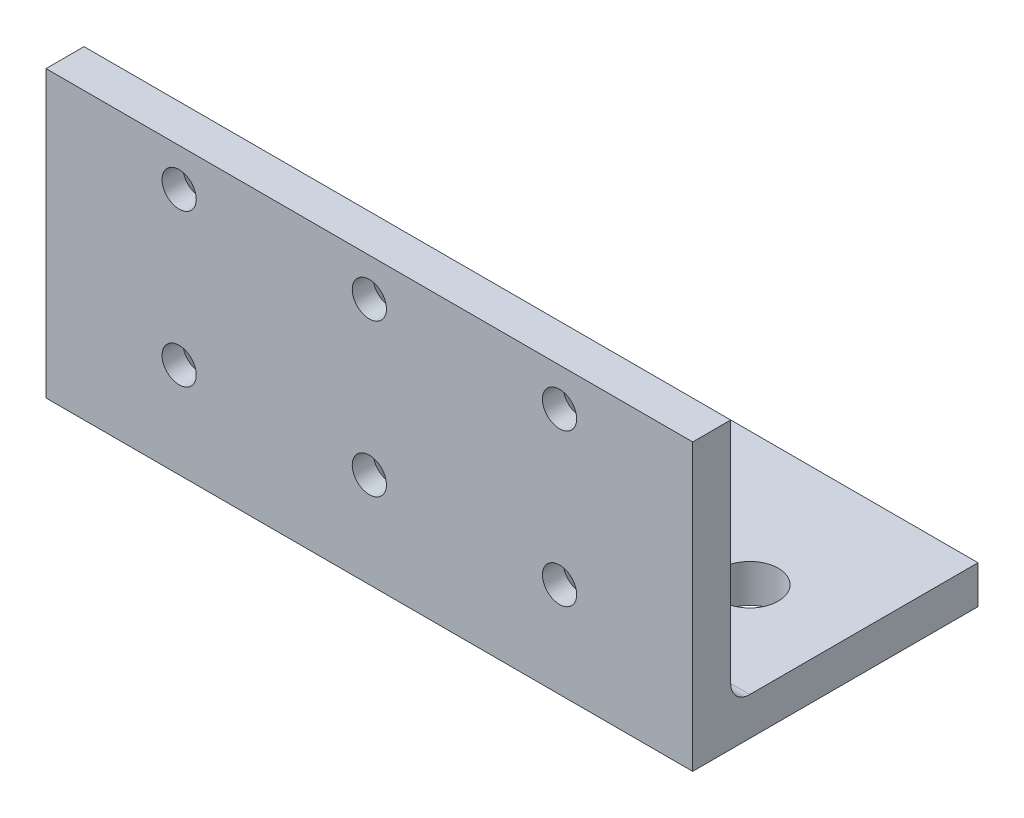
ISO-10303-21;
HEADER;
FILE_DESCRIPTION(('STEP AP214'),'2;1');
FILE_NAME('part.step','',(''),(''),'','','');
FILE_SCHEMA(('AUTOMOTIVE_DESIGN { 1 0 10303 214 1 1 1 1 }'));
ENDSEC;
DATA;
#1=APPLICATION_CONTEXT('core data for automotive mechanical design processes');
#2=APPLICATION_PROTOCOL_DEFINITION('international standard','automotive_design',2000,#1);
#3=PRODUCT_CONTEXT('',#1,'mechanical');
#4=PRODUCT('Part','Part','',(#3));
#5=PRODUCT_RELATED_PRODUCT_CATEGORY('part','',(#4));
#6=PRODUCT_DEFINITION_FORMATION('','',#4);
#7=PRODUCT_DEFINITION_CONTEXT('part definition',#1,'design');
#8=PRODUCT_DEFINITION('design','',#6,#7);
#9=PRODUCT_DEFINITION_SHAPE('','',#8);
#10=(LENGTH_UNIT() NAMED_UNIT(*) SI_UNIT(.MILLI.,.METRE.));
#11=(NAMED_UNIT(*) PLANE_ANGLE_UNIT() SI_UNIT($,.RADIAN.));
#12=(NAMED_UNIT(*) SI_UNIT($,.STERADIAN.) SOLID_ANGLE_UNIT());
#13=UNCERTAINTY_MEASURE_WITH_UNIT(LENGTH_MEASURE(1.E-05),#10,'distance_accuracy_value','');
#14=(GEOMETRIC_REPRESENTATION_CONTEXT(3) GLOBAL_UNCERTAINTY_ASSIGNED_CONTEXT((#13)) GLOBAL_UNIT_ASSIGNED_CONTEXT((#10,
#11,#12)) REPRESENTATION_CONTEXT('',''));
#15=CARTESIAN_POINT('',(0.,0.,0.));
#16=DIRECTION('',(0.,0.,1.));
#17=DIRECTION('',(1.,0.,0.));
#18=AXIS2_PLACEMENT_3D('',#15,#16,#17);
#19=CARTESIAN_POINT('',(34.,14.9999999999999,-2.00000000000061));
#20=DIRECTION('',(0.,-1.,0.));
#21=DIRECTION('',(0.,0.,-1.));
#22=AXIS2_PLACEMENT_3D('',#19,#20,#21);
#23=PLANE('',#22);
#24=DIRECTION('',(0.,0.,1.));
#25=VECTOR('',#24,1.);
#26=CARTESIAN_POINT('',(0.,15.,-1.99999999999986));
#27=LINE('',#26,#25);
#28=CARTESIAN_POINT('',(0.,15.,-1.99999999999986));
#29=VERTEX_POINT('',#28);
#30=CARTESIAN_POINT('',(0.,14.9999999999999,1.38777878078145E-13));
#31=VERTEX_POINT('',#30);
#32=EDGE_CURVE('E131',#29,#31,#27,.T.);
#33=ORIENTED_EDGE('',*,*,#32,.T.);
#34=DIRECTION('',(-1.,0.,0.));
#35=VECTOR('',#34,1.);
#36=CARTESIAN_POINT('',(34.,15.,-6.10622663543836E-13));
#37=LINE('',#36,#35);
#38=CARTESIAN_POINT('',(34.,15.,-6.10622663543836E-13));
#39=VERTEX_POINT('',#38);
#40=EDGE_CURVE('E112',#39,#31,#37,.T.);
#41=ORIENTED_EDGE('',*,*,#40,.F.);
#42=DIRECTION('',(0.,0.,1.));
#43=VECTOR('',#42,1.);
#44=CARTESIAN_POINT('',(34.,14.9999999999999,-2.00000000000061));
#45=LINE('',#44,#43);
#46=CARTESIAN_POINT('',(34.,14.9999999999999,-2.00000000000061));
#47=VERTEX_POINT('',#46);
#48=EDGE_CURVE('E119',#47,#39,#45,.T.);
#49=ORIENTED_EDGE('',*,*,#48,.F.);
#50=DIRECTION('',(-1.,0.,0.));
#51=VECTOR('',#50,1.);
#52=CARTESIAN_POINT('',(34.,14.9999999999999,-2.00000000000061));
#53=LINE('',#52,#51);
#54=EDGE_CURVE('E173',#47,#29,#53,.T.);
#55=ORIENTED_EDGE('',*,*,#54,.T.);
#56=EDGE_LOOP('',(#33,#41,#49,#55));
#57=FACE_BOUND('',#56,.T.);
#58=ADVANCED_FACE('F47',(#57),#23,.F.);
#59=CARTESIAN_POINT('',(34.,15.,-6.10622663543836E-13));
#60=DIRECTION('',(0.,0.,-1.));
#61=DIRECTION('',(0.,1.,0.));
#62=AXIS2_PLACEMENT_3D('',#59,#60,#61);
#63=PLANE('',#62);
#64=CARTESIAN_POINT('',(27.,4.9999999999999,-7.07767178198537E-13));
#65=DIRECTION('',(0.,0.,-1.));
#66=DIRECTION('',(0.,1.,0.));
#67=AXIS2_PLACEMENT_3D('',#64,#65,#66);
#68=CIRCLE('',#67,0.899999999999995);
#69=CARTESIAN_POINT('',(27.,5.89999999999989,-6.99611932931878E-13));
#70=VERTEX_POINT('',#69);
#71=EDGE_CURVE('E380',#70,#70,#68,.T.);
#72=ORIENTED_EDGE('',*,*,#71,.T.);
#73=EDGE_LOOP('',(#72));
#74=FACE_BOUND('',#73,.T.);
#75=CARTESIAN_POINT('',(26.9999999999997,12.9999999999999,-7.63278329429795E-13));
#76=DIRECTION('',(0.,0.,-1.));
#77=DIRECTION('',(0.,1.,0.));
#78=AXIS2_PLACEMENT_3D('',#75,#76,#77);
#79=CIRCLE('',#78,0.899999999999995);
#80=CARTESIAN_POINT('',(26.9999999999997,13.8999999999999,-7.55123084163136E-13));
#81=VERTEX_POINT('',#80);
#82=EDGE_CURVE('E389',#81,#81,#79,.T.);
#83=ORIENTED_EDGE('',*,*,#82,.T.);
#84=EDGE_LOOP('',(#83));
#85=FACE_BOUND('',#84,.T.);
#86=CARTESIAN_POINT('',(7.00000000000001,4.9999999999999,0.));
#87=DIRECTION('',(0.,0.,-1.));
#88=DIRECTION('',(0.,1.,0.));
#89=AXIS2_PLACEMENT_3D('',#86,#87,#88);
#90=CIRCLE('',#89,0.899999999999995);
#91=CARTESIAN_POINT('',(7.00000000000001,5.89999999999989,0.));
#92=VERTEX_POINT('',#91);
#93=EDGE_CURVE('E398',#92,#92,#90,.T.);
#94=ORIENTED_EDGE('',*,*,#93,.T.);
#95=EDGE_LOOP('',(#94));
#96=FACE_BOUND('',#95,.T.);
#97=CARTESIAN_POINT('',(6.99999999999973,12.9999999999999,0.));
#98=DIRECTION('',(0.,0.,-1.));
#99=DIRECTION('',(0.,1.,0.));
#100=AXIS2_PLACEMENT_3D('',#97,#98,#99);
#101=CIRCLE('',#100,0.899999999999995);
#102=CARTESIAN_POINT('',(6.99999999999973,13.8999999999999,0.));
#103=VERTEX_POINT('',#102);
#104=EDGE_CURVE('E407',#103,#103,#101,.T.);
#105=ORIENTED_EDGE('',*,*,#104,.T.);
#106=EDGE_LOOP('',(#105));
#107=FACE_BOUND('',#106,.T.);
#108=CARTESIAN_POINT('',(16.9999999999997,13.,-2.63677968348475E-13));
#109=DIRECTION('',(0.,0.,-1.));
#110=DIRECTION('',(0.,1.,0.));
#111=AXIS2_PLACEMENT_3D('',#108,#109,#110);
#112=CIRCLE('',#111,0.899999999999995);
#113=CARTESIAN_POINT('',(16.9999999999997,13.9,-2.55522723081815E-13));
#114=VERTEX_POINT('',#113);
#115=EDGE_CURVE('E51',#114,#114,#112,.T.);
#116=ORIENTED_EDGE('',*,*,#115,.T.);
#117=EDGE_LOOP('',(#116));
#118=FACE_BOUND('',#117,.T.);
#119=CARTESIAN_POINT('',(17.,4.99999999999998,0.));
#120=DIRECTION('',(0.,0.,-1.));
#121=DIRECTION('',(0.,1.,0.));
#122=AXIS2_PLACEMENT_3D('',#119,#120,#121);
#123=CIRCLE('',#122,0.899999999999995);
#124=CARTESIAN_POINT('',(17.,5.89999999999997,0.));
#125=VERTEX_POINT('',#124);
#126=EDGE_CURVE('E148',#125,#125,#123,.T.);
#127=ORIENTED_EDGE('',*,*,#126,.T.);
#128=EDGE_LOOP('',(#127));
#129=FACE_BOUND('',#128,.T.);
#130=DIRECTION('',(0.,-1.,0.));
#131=VECTOR('',#130,1.);
#132=CARTESIAN_POINT('',(0.,14.9999999999999,1.38777878078145E-13));
#133=LINE('',#132,#131);
#134=CARTESIAN_POINT('',(0.,0.,0.));
#135=VERTEX_POINT('',#134);
#136=EDGE_CURVE('E175',#31,#135,#133,.T.);
#137=ORIENTED_EDGE('',*,*,#136,.T.);
#138=DIRECTION('',(-1.,0.,0.));
#139=VECTOR('',#138,1.);
#140=CARTESIAN_POINT('',(34.,0.,-3.05311331771918E-13));
#141=LINE('',#140,#139);
#142=CARTESIAN_POINT('',(34.,0.,-3.05311331771918E-13));
#143=VERTEX_POINT('',#142);
#144=EDGE_CURVE('E115',#143,#135,#141,.T.);
#145=ORIENTED_EDGE('',*,*,#144,.F.);
#146=DIRECTION('',(0.,-1.,0.));
#147=VECTOR('',#146,1.);
#148=CARTESIAN_POINT('',(34.,15.,-6.10622663543836E-13));
#149=LINE('',#148,#147);
#150=EDGE_CURVE('E108',#39,#143,#149,.T.);
#151=ORIENTED_EDGE('',*,*,#150,.F.);
#152=ORIENTED_EDGE('',*,*,#40,.T.);
#153=EDGE_LOOP('',(#137,#145,#151,#152));
#154=FACE_BOUND('',#153,.T.);
#155=ADVANCED_FACE('F110',(#74,#85,#96,#107,#118,#129,#154),#63,.F.);
#156=CARTESIAN_POINT('',(34.,0.,-3.05311331771918E-13));
#157=DIRECTION('',(0.,1.,0.));
#158=DIRECTION('',(0.,0.,1.));
#159=AXIS2_PLACEMENT_3D('',#156,#157,#158);
#160=PLANE('',#159);
#161=CARTESIAN_POINT('',(28.999999992422,0.,-7.9999999929985));
#162=DIRECTION('',(0.,-1.,0.));
#163=DIRECTION('',(0.,0.,-1.));
#164=AXIS2_PLACEMENT_3D('',#161,#162,#163);
#165=CIRCLE('',#164,1.5);
#166=CARTESIAN_POINT('',(28.999999992422,0.,-9.4999999929985));
#167=VERTEX_POINT('',#166);
#168=EDGE_CURVE('E146',#167,#167,#165,.T.);
#169=ORIENTED_EDGE('',*,*,#168,.F.);
#170=EDGE_LOOP('',(#169));
#171=FACE_BOUND('',#170,.T.);
#172=CARTESIAN_POINT('',(5.,0.,-8.00000000000001));
#173=DIRECTION('',(0.,-1.,0.));
#174=DIRECTION('',(0.,0.,-1.));
#175=AXIS2_PLACEMENT_3D('',#172,#173,#174);
#176=CIRCLE('',#175,1.5);
#177=CARTESIAN_POINT('',(5.,0.,-9.50000000000001));
#178=VERTEX_POINT('',#177);
#179=EDGE_CURVE('E150',#178,#178,#176,.T.);
#180=ORIENTED_EDGE('',*,*,#179,.F.);
#181=EDGE_LOOP('',(#180));
#182=FACE_BOUND('',#181,.T.);
#183=DIRECTION('',(0.,0.,-1.));
#184=VECTOR('',#183,1.);
#185=CARTESIAN_POINT('',(0.,0.,0.));
#186=LINE('',#185,#184);
#187=CARTESIAN_POINT('',(0.,0.,-14.9999999999999));
#188=VERTEX_POINT('',#187);
#189=EDGE_CURVE('E177',#135,#188,#186,.T.);
#190=ORIENTED_EDGE('',*,*,#189,.T.);
#191=DIRECTION('',(-1.,0.,0.));
#192=VECTOR('',#191,1.);
#193=CARTESIAN_POINT('',(34.,0.,-15.0000000000004));
#194=LINE('',#193,#192);
#195=CARTESIAN_POINT('',(34.,0.,-15.0000000000004));
#196=VERTEX_POINT('',#195);
#197=EDGE_CURVE('E136',#196,#188,#194,.T.);
#198=ORIENTED_EDGE('',*,*,#197,.F.);
#199=DIRECTION('',(0.,0.,-1.));
#200=VECTOR('',#199,1.);
#201=CARTESIAN_POINT('',(34.,0.,-3.05311331771918E-13));
#202=LINE('',#201,#200);
#203=EDGE_CURVE('E118',#143,#196,#202,.T.);
#204=ORIENTED_EDGE('',*,*,#203,.F.);
#205=ORIENTED_EDGE('',*,*,#144,.T.);
#206=EDGE_LOOP('',(#190,#198,#204,#205));
#207=FACE_BOUND('',#206,.T.);
#208=ADVANCED_FACE('F203',(#171,#182,#207),#160,.F.);
#209=CARTESIAN_POINT('',(34.,0.,-15.0000000000004));
#210=DIRECTION('',(0.,0.,1.));
#211=DIRECTION('',(1.,0.,0.));
#212=AXIS2_PLACEMENT_3D('',#209,#210,#211);
#213=PLANE('',#212);
#214=DIRECTION('',(0.,1.,0.));
#215=VECTOR('',#214,1.);
#216=CARTESIAN_POINT('',(0.,0.,-14.9999999999999));
#217=LINE('',#216,#215);
#218=CARTESIAN_POINT('',(0.,1.99999999999991,-14.9999999999999));
#219=VERTEX_POINT('',#218);
#220=EDGE_CURVE('E179',#188,#219,#217,.T.);
#221=ORIENTED_EDGE('',*,*,#220,.T.);
#222=DIRECTION('',(-1.,0.,0.));
#223=VECTOR('',#222,1.);
#224=CARTESIAN_POINT('',(34.,2.00000000000005,-15.0000000000004));
#225=LINE('',#224,#223);
#226=CARTESIAN_POINT('',(34.,2.00000000000005,-15.0000000000004));
#227=VERTEX_POINT('',#226);
#228=EDGE_CURVE('E185',#227,#219,#225,.T.);
#229=ORIENTED_EDGE('',*,*,#228,.F.);
#230=DIRECTION('',(0.,1.,0.));
#231=VECTOR('',#230,1.);
#232=CARTESIAN_POINT('',(34.,0.,-15.0000000000004));
#233=LINE('',#232,#231);
#234=EDGE_CURVE('E168',#196,#227,#233,.T.);
#235=ORIENTED_EDGE('',*,*,#234,.F.);
#236=ORIENTED_EDGE('',*,*,#197,.T.);
#237=EDGE_LOOP('',(#221,#229,#235,#236));
#238=FACE_BOUND('',#237,.T.);
#239=ADVANCED_FACE('F192',(#238),#213,.F.);
#240=CARTESIAN_POINT('',(34.,2.00000000000005,-15.0000000000004));
#241=DIRECTION('',(0.,-1.,0.));
#242=DIRECTION('',(0.,0.,-1.));
#243=AXIS2_PLACEMENT_3D('',#240,#241,#242);
#244=PLANE('',#243);
#245=CARTESIAN_POINT('',(28.999999992422,2.,-7.99999999299864));
#246=DIRECTION('',(0.,-1.,0.));
#247=DIRECTION('',(0.,0.,-1.));
#248=AXIS2_PLACEMENT_3D('',#245,#246,#247);
#249=CIRCLE('',#248,1.5);
#250=CARTESIAN_POINT('',(28.999999992422,1.99999999999998,-9.49999999299864));
#251=VERTEX_POINT('',#250);
#252=EDGE_CURVE('E145',#251,#251,#249,.T.);
#253=ORIENTED_EDGE('',*,*,#252,.T.);
#254=EDGE_LOOP('',(#253));
#255=FACE_BOUND('',#254,.T.);
#256=CARTESIAN_POINT('',(5.,1.99999999999999,-8.00000000000015));
#257=DIRECTION('',(0.,-1.,0.));
#258=DIRECTION('',(0.,0.,-1.));
#259=AXIS2_PLACEMENT_3D('',#256,#257,#258);
#260=CIRCLE('',#259,1.5);
#261=CARTESIAN_POINT('',(5.,1.99999999999998,-9.50000000000015));
#262=VERTEX_POINT('',#261);
#263=EDGE_CURVE('E142',#262,#262,#260,.T.);
#264=ORIENTED_EDGE('',*,*,#263,.T.);
#265=EDGE_LOOP('',(#264));
#266=FACE_BOUND('',#265,.T.);
#267=DIRECTION('',(0.,0.,1.));
#268=VECTOR('',#267,1.);
#269=CARTESIAN_POINT('',(0.,1.99999999999991,-14.9999999999999));
#270=LINE('',#269,#268);
#271=CARTESIAN_POINT('',(0.,2.00000000000008,-3.00000000000011));
#272=VERTEX_POINT('',#271);
#273=EDGE_CURVE('E181',#219,#272,#270,.T.);
#274=ORIENTED_EDGE('',*,*,#273,.T.);
#275=DIRECTION('',(-1.,0.,0.));
#276=VECTOR('',#275,1.);
#277=CARTESIAN_POINT('',(34.,2.,-3.00000000000042));
#278=LINE('',#277,#276);
#279=CARTESIAN_POINT('',(34.,2.,-3.00000000000042));
#280=VERTEX_POINT('',#279);
#281=EDGE_CURVE('E64',#272,#280,#278,.F.);
#282=ORIENTED_EDGE('',*,*,#281,.T.);
#283=DIRECTION('',(0.,0.,1.));
#284=VECTOR('',#283,1.);
#285=CARTESIAN_POINT('',(34.,2.00000000000005,-15.0000000000004));
#286=LINE('',#285,#284);
#287=EDGE_CURVE('E170',#227,#280,#286,.T.);
#288=ORIENTED_EDGE('',*,*,#287,.F.);
#289=ORIENTED_EDGE('',*,*,#228,.T.);
#290=EDGE_LOOP('',(#274,#282,#288,#289));
#291=FACE_BOUND('',#290,.T.);
#292=ADVANCED_FACE('F197',(#255,#266,#291),#244,.F.);
#293=CARTESIAN_POINT('',(34.0000000000001,2.,-2.00000000000031));
#294=DIRECTION('',(0.,0.,1.));
#295=DIRECTION('',(0.,-1.,0.));
#296=AXIS2_PLACEMENT_3D('',#293,#294,#295);
#297=PLANE('',#296);
#298=CARTESIAN_POINT('',(27.0000000000003,4.99999999999992,-2.00000000000071));
#299=DIRECTION('',(0.,0.,-1.));
#300=DIRECTION('',(0.,1.,0.));
#301=AXIS2_PLACEMENT_3D('',#298,#299,#300);
#302=CIRCLE('',#301,1.8);
#303=CARTESIAN_POINT('',(27.0000000000003,6.79999999999992,-2.00000000000069));
#304=VERTEX_POINT('',#303);
#305=EDGE_CURVE('E379',#304,#304,#302,.T.);
#306=ORIENTED_EDGE('',*,*,#305,.F.);
#307=EDGE_LOOP('',(#306));
#308=FACE_BOUND('',#307,.T.);
#309=CARTESIAN_POINT('',(26.9999999999997,12.9999999999999,-2.00000000000067));
#310=DIRECTION('',(0.,0.,-1.));
#311=DIRECTION('',(0.,1.,0.));
#312=AXIS2_PLACEMENT_3D('',#309,#310,#311);
#313=CIRCLE('',#312,1.8);
#314=CARTESIAN_POINT('',(26.9999999999997,14.7999999999999,-2.00000000000065));
#315=VERTEX_POINT('',#314);
#316=EDGE_CURVE('E386',#315,#315,#313,.T.);
#317=ORIENTED_EDGE('',*,*,#316,.F.);
#318=EDGE_LOOP('',(#317));
#319=FACE_BOUND('',#318,.T.);
#320=CARTESIAN_POINT('',(7.00000000000028,4.99999999999998,-2.00000000000004));
#321=DIRECTION('',(0.,0.,-1.));
#322=DIRECTION('',(0.,1.,0.));
#323=AXIS2_PLACEMENT_3D('',#320,#321,#322);
#324=CIRCLE('',#323,1.8);
#325=CARTESIAN_POINT('',(7.00000000000028,6.79999999999998,-2.00000000000003));
#326=VERTEX_POINT('',#325);
#327=EDGE_CURVE('E395',#326,#326,#324,.T.);
#328=ORIENTED_EDGE('',*,*,#327,.F.);
#329=EDGE_LOOP('',(#328));
#330=FACE_BOUND('',#329,.T.);
#331=CARTESIAN_POINT('',(6.99999999999973,13.,-2.00000000000003));
#332=DIRECTION('',(0.,0.,-1.));
#333=DIRECTION('',(0.,1.,0.));
#334=AXIS2_PLACEMENT_3D('',#331,#332,#333);
#335=CIRCLE('',#334,1.8);
#336=CARTESIAN_POINT('',(6.99999999999973,14.8,-2.00000000000001));
#337=VERTEX_POINT('',#336);
#338=EDGE_CURVE('E404',#337,#337,#335,.T.);
#339=ORIENTED_EDGE('',*,*,#338,.F.);
#340=EDGE_LOOP('',(#339));
#341=FACE_BOUND('',#340,.T.);
#342=CARTESIAN_POINT('',(16.9999999999997,13.,-1.99999999999995));
#343=DIRECTION('',(0.,0.,-1.));
#344=DIRECTION('',(0.,1.,0.));
#345=AXIS2_PLACEMENT_3D('',#342,#343,#344);
#346=CIRCLE('',#345,1.8);
#347=CARTESIAN_POINT('',(16.9999999999997,14.8,-1.99999999999993));
#348=VERTEX_POINT('',#347);
#349=EDGE_CURVE('E413',#348,#348,#346,.T.);
#350=ORIENTED_EDGE('',*,*,#349,.F.);
#351=EDGE_LOOP('',(#350));
#352=FACE_BOUND('',#351,.T.);
#353=CARTESIAN_POINT('',(17.0000000000003,4.99999999999998,-1.99999999999999));
#354=DIRECTION('',(0.,0.,-1.));
#355=DIRECTION('',(0.,1.,0.));
#356=AXIS2_PLACEMENT_3D('',#353,#354,#355);
#357=CIRCLE('',#356,1.8);
#358=CARTESIAN_POINT('',(17.0000000000003,6.79999999999998,-1.99999999999997));
#359=VERTEX_POINT('',#358);
#360=EDGE_CURVE('E157',#359,#359,#357,.T.);
#361=ORIENTED_EDGE('',*,*,#360,.F.);
#362=EDGE_LOOP('',(#361));
#363=FACE_BOUND('',#362,.T.);
#364=DIRECTION('',(0.,1.,0.));
#365=VECTOR('',#364,1.);
#366=CARTESIAN_POINT('',(34.0000000000001,2.,-2.00000000000031));
#367=LINE('',#366,#365);
#368=CARTESIAN_POINT('',(34.0000000000003,2.99999999999989,-2.00000000000031));
#369=VERTEX_POINT('',#368);
#370=EDGE_CURVE('E124',#369,#47,#367,.T.);
#371=ORIENTED_EDGE('',*,*,#370,.F.);
#372=DIRECTION('',(-1.,0.,0.));
#373=VECTOR('',#372,1.);
#374=CARTESIAN_POINT('',(2.77555756156289E-13,2.99999999999998,-2.));
#375=LINE('',#374,#373);
#376=CARTESIAN_POINT('',(2.77555756156289E-13,2.99999999999998,-2.));
#377=VERTEX_POINT('',#376);
#378=EDGE_CURVE('E132',#369,#377,#375,.T.);
#379=ORIENTED_EDGE('',*,*,#378,.T.);
#380=DIRECTION('',(0.,1.,0.));
#381=VECTOR('',#380,1.);
#382=CARTESIAN_POINT('',(0.,2.00000000000009,-2.));
#383=LINE('',#382,#381);
#384=EDGE_CURVE('E128',#377,#29,#383,.T.);
#385=ORIENTED_EDGE('',*,*,#384,.T.);
#386=ORIENTED_EDGE('',*,*,#54,.F.);
#387=EDGE_LOOP('',(#371,#379,#385,#386));
#388=FACE_BOUND('',#387,.T.);
#389=ADVANCED_FACE('F202',(#308,#319,#330,#341,#352,#363,#388),#297,.F.);
#390=CARTESIAN_POINT('',(34.,0.,-3.05311331771918E-13));
#391=DIRECTION('',(1.,0.,0.));
#392=DIRECTION('',(0.,0.,-1.));
#393=AXIS2_PLACEMENT_3D('',#390,#391,#392);
#394=PLANE('',#393);
#395=ORIENTED_EDGE('',*,*,#48,.T.);
#396=ORIENTED_EDGE('',*,*,#150,.T.);
#397=ORIENTED_EDGE('',*,*,#203,.T.);
#398=ORIENTED_EDGE('',*,*,#234,.T.);
#399=ORIENTED_EDGE('',*,*,#287,.T.);
#400=CARTESIAN_POINT('',(34.,2.99999999999989,-3.00000000000042));
#401=DIRECTION('',(1.,0.,0.));
#402=DIRECTION('',(0.,0.,-1.));
#403=AXIS2_PLACEMENT_3D('',#400,#401,#402);
#404=CIRCLE('',#403,1.);
#405=EDGE_CURVE('E11',#280,#369,#404,.F.);
#406=ORIENTED_EDGE('',*,*,#405,.T.);
#407=ORIENTED_EDGE('',*,*,#370,.T.);
#408=EDGE_LOOP('',(#395,#396,#397,#398,#399,#406,#407));
#409=FACE_BOUND('',#408,.T.);
#410=ADVANCED_FACE('F122',(#409),#394,.T.);
#411=CARTESIAN_POINT('',(0.,0.,0.));
#412=DIRECTION('',(1.,0.,0.));
#413=DIRECTION('',(0.,0.,-1.));
#414=AXIS2_PLACEMENT_3D('',#411,#412,#413);
#415=PLANE('',#414);
#416=ORIENTED_EDGE('',*,*,#32,.F.);
#417=ORIENTED_EDGE('',*,*,#384,.F.);
#418=CARTESIAN_POINT('',(0.,2.99999999999997,-3.00000000000011));
#419=DIRECTION('',(1.,0.,0.));
#420=DIRECTION('',(0.,0.,-1.));
#421=AXIS2_PLACEMENT_3D('',#418,#419,#420);
#422=CIRCLE('',#421,1.);
#423=EDGE_CURVE('E56',#377,#272,#422,.T.);
#424=ORIENTED_EDGE('',*,*,#423,.T.);
#425=ORIENTED_EDGE('',*,*,#273,.F.);
#426=ORIENTED_EDGE('',*,*,#220,.F.);
#427=ORIENTED_EDGE('',*,*,#189,.F.);
#428=ORIENTED_EDGE('',*,*,#136,.F.);
#429=EDGE_LOOP('',(#416,#417,#424,#425,#426,#427,#428));
#430=FACE_BOUND('',#429,.T.);
#431=ADVANCED_FACE('F196',(#430),#415,.F.);
#432=CARTESIAN_POINT('',(34.,2.99999999999989,-3.00000000000042));
#433=DIRECTION('',(1.,0.,0.));
#434=DIRECTION('',(0.,0.,-1.));
#435=AXIS2_PLACEMENT_3D('',#432,#433,#434);
#436=CYLINDRICAL_SURFACE('',#435,1.);
#437=ORIENTED_EDGE('',*,*,#405,.F.);
#438=ORIENTED_EDGE('',*,*,#281,.F.);
#439=ORIENTED_EDGE('',*,*,#423,.F.);
#440=ORIENTED_EDGE('',*,*,#378,.F.);
#441=EDGE_LOOP('',(#437,#438,#439,#440));
#442=FACE_BOUND('',#441,.T.);
#443=ADVANCED_FACE('F49',(#442),#436,.F.);
#444=CARTESIAN_POINT('',(4.99999999999973,9.99999999999997,-7.99999999999999));
#445=DIRECTION('',(0.,-1.,0.));
#446=DIRECTION('',(0.,0.,-1.));
#447=AXIS2_PLACEMENT_3D('',#444,#445,#446);
#448=CYLINDRICAL_SURFACE('',#447,1.5);
#449=ORIENTED_EDGE('',*,*,#179,.T.);
#450=EDGE_LOOP('',(#449));
#451=FACE_BOUND('',#450,.T.);
#452=ORIENTED_EDGE('',*,*,#263,.F.);
#453=EDGE_LOOP('',(#452));
#454=FACE_BOUND('',#453,.T.);
#455=ADVANCED_FACE('F261',(#451,#454),#448,.F.);
#456=CARTESIAN_POINT('',(28.9999999924217,10.,-7.99999999299854));
#457=DIRECTION('',(0.,-1.,0.));
#458=DIRECTION('',(0.,0.,-1.));
#459=AXIS2_PLACEMENT_3D('',#456,#457,#458);
#460=CYLINDRICAL_SURFACE('',#459,1.5);
#461=ORIENTED_EDGE('',*,*,#168,.T.);
#462=EDGE_LOOP('',(#461));
#463=FACE_BOUND('',#462,.T.);
#464=ORIENTED_EDGE('',*,*,#252,.F.);
#465=EDGE_LOOP('',(#464));
#466=FACE_BOUND('',#465,.T.);
#467=ADVANCED_FACE('F267',(#463,#466),#460,.F.);
#468=CARTESIAN_POINT('',(17.0000000000003,4.99999999999998,-1.99999999999999));
#469=DIRECTION('',(0.,0.,-1.));
#470=DIRECTION('',(0.,1.,0.));
#471=AXIS2_PLACEMENT_3D('',#468,#469,#470);
#472=CYLINDRICAL_SURFACE('',#471,0.899999999999995);
#473=CARTESIAN_POINT('',(17.,4.99999999999998,-1.10000000000009));
#474=DIRECTION('',(0.,0.,-1.));
#475=DIRECTION('',(0.,1.,0.));
#476=AXIS2_PLACEMENT_3D('',#473,#474,#475);
#477=CIRCLE('',#476,0.899999999999998);
#478=CARTESIAN_POINT('',(17.,5.89999999999997,-1.10000000000008));
#479=VERTEX_POINT('',#478);
#480=EDGE_CURVE('E151',#479,#479,#477,.T.);
#481=ORIENTED_EDGE('',*,*,#480,.T.);
#482=EDGE_LOOP('',(#481));
#483=FACE_BOUND('',#482,.T.);
#484=ORIENTED_EDGE('',*,*,#126,.F.);
#485=EDGE_LOOP('',(#484));
#486=FACE_BOUND('',#485,.T.);
#487=ADVANCED_FACE('F275',(#483,#486),#472,.F.);
#488=CARTESIAN_POINT('',(17.0000000000003,4.99999999999998,-1.99999999999999));
#489=DIRECTION('',(0.,0.,-1.));
#490=DIRECTION('',(0.,1.,0.));
#491=AXIS2_PLACEMENT_3D('',#488,#489,#490);
#492=CONICAL_SURFACE('',#491,1.8,0.785398163397446);
#493=ORIENTED_EDGE('',*,*,#480,.F.);
#494=EDGE_LOOP('',(#493));
#495=FACE_BOUND('',#494,.T.);
#496=ORIENTED_EDGE('',*,*,#360,.T.);
#497=EDGE_LOOP('',(#496));
#498=FACE_BOUND('',#497,.T.);
#499=ADVANCED_FACE('F283',(#495,#498),#492,.F.);
#500=CARTESIAN_POINT('',(16.9999999999997,13.,-1.99999999999995));
#501=DIRECTION('',(0.,0.,-1.));
#502=DIRECTION('',(0.,1.,0.));
#503=AXIS2_PLACEMENT_3D('',#500,#501,#502);
#504=CYLINDRICAL_SURFACE('',#503,0.899999999999995);
#505=CARTESIAN_POINT('',(16.9999999999997,13.,-1.10000000000005));
#506=DIRECTION('',(0.,0.,-1.));
#507=DIRECTION('',(0.,1.,0.));
#508=AXIS2_PLACEMENT_3D('',#505,#506,#507);
#509=CIRCLE('',#508,0.899999999999998);
#510=CARTESIAN_POINT('',(16.9999999999997,13.9,-1.10000000000004));
#511=VERTEX_POINT('',#510);
#512=EDGE_CURVE('E415',#511,#511,#509,.T.);
#513=ORIENTED_EDGE('',*,*,#512,.T.);
#514=EDGE_LOOP('',(#513));
#515=FACE_BOUND('',#514,.T.);
#516=ORIENTED_EDGE('',*,*,#115,.F.);
#517=EDGE_LOOP('',(#516));
#518=FACE_BOUND('',#517,.T.);
#519=ADVANCED_FACE('F290',(#515,#518),#504,.F.);
#520=CARTESIAN_POINT('',(16.9999999999997,13.,-1.99999999999995));
#521=DIRECTION('',(0.,0.,-1.));
#522=DIRECTION('',(0.,1.,0.));
#523=AXIS2_PLACEMENT_3D('',#520,#521,#522);
#524=CONICAL_SURFACE('',#523,1.8,0.785398163397446);
#525=ORIENTED_EDGE('',*,*,#512,.F.);
#526=EDGE_LOOP('',(#525));
#527=FACE_BOUND('',#526,.T.);
#528=ORIENTED_EDGE('',*,*,#349,.T.);
#529=EDGE_LOOP('',(#528));
#530=FACE_BOUND('',#529,.T.);
#531=ADVANCED_FACE('F298',(#527,#530),#524,.F.);
#532=CARTESIAN_POINT('',(6.99999999999973,13.,-2.00000000000003));
#533=DIRECTION('',(0.,0.,-1.));
#534=DIRECTION('',(0.,1.,0.));
#535=AXIS2_PLACEMENT_3D('',#532,#533,#534);
#536=CYLINDRICAL_SURFACE('',#535,0.899999999999995);
#537=CARTESIAN_POINT('',(6.99999999999973,12.9999999999999,-1.10000000000013));
#538=DIRECTION('',(0.,0.,-1.));
#539=DIRECTION('',(0.,1.,0.));
#540=AXIS2_PLACEMENT_3D('',#537,#538,#539);
#541=CIRCLE('',#540,0.899999999999998);
#542=CARTESIAN_POINT('',(6.99999999999973,13.8999999999999,-1.10000000000012));
#543=VERTEX_POINT('',#542);
#544=EDGE_CURVE('E410',#543,#543,#541,.T.);
#545=ORIENTED_EDGE('',*,*,#544,.T.);
#546=EDGE_LOOP('',(#545));
#547=FACE_BOUND('',#546,.T.);
#548=ORIENTED_EDGE('',*,*,#104,.F.);
#549=EDGE_LOOP('',(#548));
#550=FACE_BOUND('',#549,.T.);
#551=ADVANCED_FACE('F306',(#547,#550),#536,.F.);
#552=CARTESIAN_POINT('',(6.99999999999973,13.,-2.00000000000003));
#553=DIRECTION('',(0.,0.,-1.));
#554=DIRECTION('',(0.,1.,0.));
#555=AXIS2_PLACEMENT_3D('',#552,#553,#554);
#556=CONICAL_SURFACE('',#555,1.8,0.785398163397446);
#557=ORIENTED_EDGE('',*,*,#544,.F.);
#558=EDGE_LOOP('',(#557));
#559=FACE_BOUND('',#558,.T.);
#560=ORIENTED_EDGE('',*,*,#338,.T.);
#561=EDGE_LOOP('',(#560));
#562=FACE_BOUND('',#561,.T.);
#563=ADVANCED_FACE('F314',(#559,#562),#556,.F.);
#564=CARTESIAN_POINT('',(7.00000000000028,4.99999999999998,-2.00000000000004));
#565=DIRECTION('',(0.,0.,-1.));
#566=DIRECTION('',(0.,1.,0.));
#567=AXIS2_PLACEMENT_3D('',#564,#565,#566);
#568=CYLINDRICAL_SURFACE('',#567,0.899999999999995);
#569=CARTESIAN_POINT('',(7.00000000000001,4.9999999999999,-1.09999999999992));
#570=DIRECTION('',(0.,0.,-1.));
#571=DIRECTION('',(0.,1.,0.));
#572=AXIS2_PLACEMENT_3D('',#569,#570,#571);
#573=CIRCLE('',#572,0.899999999999998);
#574=CARTESIAN_POINT('',(7.00000000000001,5.89999999999989,-1.09999999999991));
#575=VERTEX_POINT('',#574);
#576=EDGE_CURVE('E401',#575,#575,#573,.T.);
#577=ORIENTED_EDGE('',*,*,#576,.T.);
#578=EDGE_LOOP('',(#577));
#579=FACE_BOUND('',#578,.T.);
#580=ORIENTED_EDGE('',*,*,#93,.F.);
#581=EDGE_LOOP('',(#580));
#582=FACE_BOUND('',#581,.T.);
#583=ADVANCED_FACE('F322',(#579,#582),#568,.F.);
#584=CARTESIAN_POINT('',(7.00000000000028,4.99999999999998,-2.00000000000004));
#585=DIRECTION('',(0.,0.,-1.));
#586=DIRECTION('',(0.,1.,0.));
#587=AXIS2_PLACEMENT_3D('',#584,#585,#586);
#588=CONICAL_SURFACE('',#587,1.8,0.785398163397446);
#589=ORIENTED_EDGE('',*,*,#576,.F.);
#590=EDGE_LOOP('',(#589));
#591=FACE_BOUND('',#590,.T.);
#592=ORIENTED_EDGE('',*,*,#327,.T.);
#593=EDGE_LOOP('',(#592));
#594=FACE_BOUND('',#593,.T.);
#595=ADVANCED_FACE('F330',(#591,#594),#588,.F.);
#596=CARTESIAN_POINT('',(26.9999999999997,12.9999999999999,-2.00000000000067));
#597=DIRECTION('',(0.,0.,-1.));
#598=DIRECTION('',(0.,1.,0.));
#599=AXIS2_PLACEMENT_3D('',#596,#597,#598);
#600=CYLINDRICAL_SURFACE('',#599,0.899999999999995);
#601=CARTESIAN_POINT('',(26.9999999999997,12.9999999999999,-1.10000000000054));
#602=DIRECTION('',(0.,0.,-1.));
#603=DIRECTION('',(0.,1.,0.));
#604=AXIS2_PLACEMENT_3D('',#601,#602,#603);
#605=CIRCLE('',#604,0.899999999999998);
#606=CARTESIAN_POINT('',(26.9999999999997,13.8999999999999,-1.10000000000054));
#607=VERTEX_POINT('',#606);
#608=EDGE_CURVE('E392',#607,#607,#605,.T.);
#609=ORIENTED_EDGE('',*,*,#608,.T.);
#610=EDGE_LOOP('',(#609));
#611=FACE_BOUND('',#610,.T.);
#612=ORIENTED_EDGE('',*,*,#82,.F.);
#613=EDGE_LOOP('',(#612));
#614=FACE_BOUND('',#613,.T.);
#615=ADVANCED_FACE('F338',(#611,#614),#600,.F.);
#616=CARTESIAN_POINT('',(26.9999999999997,12.9999999999999,-2.00000000000067));
#617=DIRECTION('',(0.,0.,-1.));
#618=DIRECTION('',(0.,1.,0.));
#619=AXIS2_PLACEMENT_3D('',#616,#617,#618);
#620=CONICAL_SURFACE('',#619,1.8,0.785398163397446);
#621=ORIENTED_EDGE('',*,*,#608,.F.);
#622=EDGE_LOOP('',(#621));
#623=FACE_BOUND('',#622,.T.);
#624=ORIENTED_EDGE('',*,*,#316,.T.);
#625=EDGE_LOOP('',(#624));
#626=FACE_BOUND('',#625,.T.);
#627=ADVANCED_FACE('F346',(#623,#626),#620,.F.);
#628=CARTESIAN_POINT('',(27.0000000000003,4.99999999999992,-2.00000000000071));
#629=DIRECTION('',(0.,0.,-1.));
#630=DIRECTION('',(0.,1.,0.));
#631=AXIS2_PLACEMENT_3D('',#628,#629,#630);
#632=CYLINDRICAL_SURFACE('',#631,0.899999999999995);
#633=CARTESIAN_POINT('',(27.,4.99999999999992,-1.10000000000059));
#634=DIRECTION('',(0.,0.,-1.));
#635=DIRECTION('',(0.,1.,0.));
#636=AXIS2_PLACEMENT_3D('',#633,#634,#635);
#637=CIRCLE('',#636,0.899999999999998);
#638=CARTESIAN_POINT('',(27.,5.89999999999992,-1.10000000000058));
#639=VERTEX_POINT('',#638);
#640=EDGE_CURVE('E376',#639,#639,#637,.T.);
#641=ORIENTED_EDGE('',*,*,#640,.T.);
#642=EDGE_LOOP('',(#641));
#643=FACE_BOUND('',#642,.T.);
#644=ORIENTED_EDGE('',*,*,#71,.F.);
#645=EDGE_LOOP('',(#644));
#646=FACE_BOUND('',#645,.T.);
#647=ADVANCED_FACE('F354',(#643,#646),#632,.F.);
#648=CARTESIAN_POINT('',(27.0000000000003,4.99999999999992,-2.00000000000071));
#649=DIRECTION('',(0.,0.,-1.));
#650=DIRECTION('',(0.,1.,0.));
#651=AXIS2_PLACEMENT_3D('',#648,#649,#650);
#652=CONICAL_SURFACE('',#651,1.8,0.785398163397446);
#653=ORIENTED_EDGE('',*,*,#640,.F.);
#654=EDGE_LOOP('',(#653));
#655=FACE_BOUND('',#654,.T.);
#656=ORIENTED_EDGE('',*,*,#305,.T.);
#657=EDGE_LOOP('',(#656));
#658=FACE_BOUND('',#657,.T.);
#659=ADVANCED_FACE('F362',(#655,#658),#652,.F.);
#660=CLOSED_SHELL('',(#58,#155,#208,#239,#292,#389,#410,#431,#443,#455,#467,#487,#499,#519,#531,
#551,#563,#583,#595,#615,#627,#647,#659));
#661=MANIFOLD_SOLID_BREP('B2',#660);
#662=ADVANCED_BREP_SHAPE_REPRESENTATION('',(#18,#661),#14);
#663=SHAPE_DEFINITION_REPRESENTATION(#9,#662);
ENDSEC;
END-ISO-10303-21;
